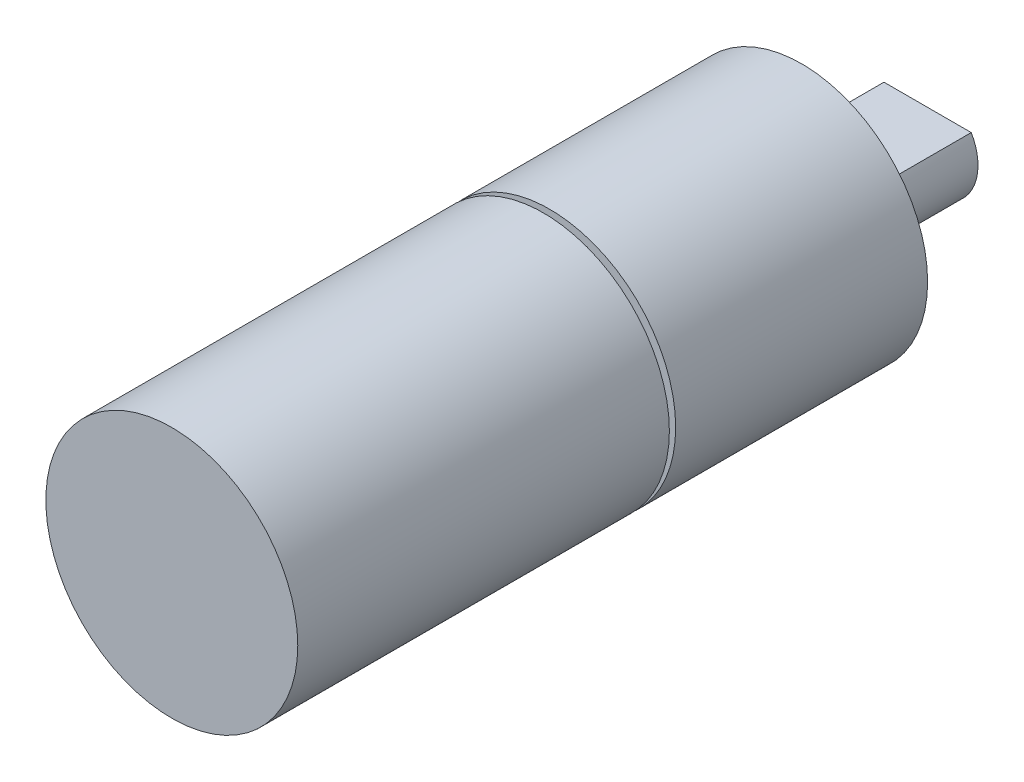
ISO-10303-21;
HEADER;
FILE_DESCRIPTION(('STEP AP214'),'2;1');
FILE_NAME('part.step','',(''),(''),'','','');
FILE_SCHEMA(('AUTOMOTIVE_DESIGN { 1 0 10303 214 1 1 1 1 }'));
ENDSEC;
DATA;
#1=APPLICATION_CONTEXT('core data for automotive mechanical design processes');
#2=APPLICATION_PROTOCOL_DEFINITION('international standard','automotive_design',2000,#1);
#3=PRODUCT_CONTEXT('',#1,'mechanical');
#4=PRODUCT('Part','Part','',(#3));
#5=PRODUCT_RELATED_PRODUCT_CATEGORY('part','',(#4));
#6=PRODUCT_DEFINITION_FORMATION('','',#4);
#7=PRODUCT_DEFINITION_CONTEXT('part definition',#1,'design');
#8=PRODUCT_DEFINITION('design','',#6,#7);
#9=PRODUCT_DEFINITION_SHAPE('','',#8);
#10=(LENGTH_UNIT() NAMED_UNIT(*) SI_UNIT(.MILLI.,.METRE.));
#11=(NAMED_UNIT(*) PLANE_ANGLE_UNIT() SI_UNIT($,.RADIAN.));
#12=(NAMED_UNIT(*) SI_UNIT($,.STERADIAN.) SOLID_ANGLE_UNIT());
#13=UNCERTAINTY_MEASURE_WITH_UNIT(LENGTH_MEASURE(1.E-05),#10,'distance_accuracy_value','');
#14=(GEOMETRIC_REPRESENTATION_CONTEXT(3) GLOBAL_UNCERTAINTY_ASSIGNED_CONTEXT((#13)) GLOBAL_UNIT_ASSIGNED_CONTEXT((#10,
#11,#12)) REPRESENTATION_CONTEXT('',''));
#15=CARTESIAN_POINT('',(0.,0.,0.));
#16=DIRECTION('',(0.,0.,1.));
#17=DIRECTION('',(1.,0.,0.));
#18=AXIS2_PLACEMENT_3D('',#15,#16,#17);
#19=CARTESIAN_POINT('',(0.,0.,24.4652891172359));
#20=DIRECTION('',(0.,0.,1.));
#21=DIRECTION('',(1.,0.,0.));
#22=AXIS2_PLACEMENT_3D('',#19,#20,#21);
#23=CYLINDRICAL_SURFACE('',#22,20.);
#24=CARTESIAN_POINT('',(0.,0.,-60.));
#25=DIRECTION('',(0.,0.,-1.));
#26=DIRECTION('',(-1.,0.,0.));
#27=AXIS2_PLACEMENT_3D('',#24,#25,#26);
#28=CIRCLE('',#27,20.);
#29=CARTESIAN_POINT('',(-20.,0.,-60.));
#30=VERTEX_POINT('',#29);
#31=EDGE_CURVE('E121',#30,#30,#28,.T.);
#32=ORIENTED_EDGE('',*,*,#31,.T.);
#33=EDGE_LOOP('',(#32));
#34=FACE_BOUND('',#33,.T.);
#35=CARTESIAN_POINT('',(0.,0.,-100.));
#36=DIRECTION('',(0.,0.,1.));
#37=DIRECTION('',(1.,0.,0.));
#38=AXIS2_PLACEMENT_3D('',#35,#36,#37);
#39=CIRCLE('',#38,20.);
#40=CARTESIAN_POINT('',(20.,0.,-100.));
#41=VERTEX_POINT('',#40);
#42=EDGE_CURVE('E47',#41,#41,#39,.T.);
#43=ORIENTED_EDGE('',*,*,#42,.T.);
#44=EDGE_LOOP('',(#43));
#45=FACE_BOUND('',#44,.T.);
#46=ADVANCED_FACE('F39',(#34,#45),#23,.T.);
#47=CARTESIAN_POINT('',(0.,20.,-100.));
#48=DIRECTION('',(0.,0.,1.));
#49=DIRECTION('',(1.,0.,0.));
#50=AXIS2_PLACEMENT_3D('',#47,#48,#49);
#51=PLANE('',#50);
#52=ORIENTED_EDGE('',*,*,#42,.F.);
#53=EDGE_LOOP('',(#52));
#54=FACE_BOUND('',#53,.T.);
#55=CARTESIAN_POINT('',(0.,0.,-100.));
#56=DIRECTION('',(0.,0.,1.));
#57=DIRECTION('',(1.,0.,0.));
#58=AXIS2_PLACEMENT_3D('',#55,#56,#57);
#59=CIRCLE('',#58,8.);
#60=CARTESIAN_POINT('',(8.,0.,-100.));
#61=VERTEX_POINT('',#60);
#62=EDGE_CURVE('E80',#61,#61,#59,.T.);
#63=ORIENTED_EDGE('',*,*,#62,.T.);
#64=EDGE_LOOP('',(#63));
#65=FACE_BOUND('',#64,.T.);
#66=ADVANCED_FACE('F89',(#54,#65),#51,.F.);
#67=CARTESIAN_POINT('',(0.,0.,24.4652891172359));
#68=DIRECTION('',(0.,0.,1.));
#69=DIRECTION('',(1.,0.,0.));
#70=AXIS2_PLACEMENT_3D('',#67,#68,#69);
#71=CYLINDRICAL_SURFACE('',#70,8.);
#72=CARTESIAN_POINT('',(0.,0.,-120.));
#73=DIRECTION('',(0.,0.,1.));
#74=DIRECTION('',(1.,0.,0.));
#75=AXIS2_PLACEMENT_3D('',#72,#73,#74);
#76=CIRCLE('',#75,8.);
#77=CARTESIAN_POINT('',(-6.92820323027551,4.,-120.));
#78=VERTEX_POINT('',#77);
#79=CARTESIAN_POINT('',(6.92820323027551,4.,-120.));
#80=VERTEX_POINT('',#79);
#81=EDGE_CURVE('E77',#78,#80,#76,.T.);
#82=ORIENTED_EDGE('',*,*,#81,.T.);
#83=DIRECTION('',(0.,0.,-1.));
#84=VECTOR('',#83,1.);
#85=CARTESIAN_POINT('',(6.92820323027551,4.,-105.));
#86=LINE('',#85,#84);
#87=CARTESIAN_POINT('',(6.92820323027551,4.,-105.));
#88=VERTEX_POINT('',#87);
#89=EDGE_CURVE('E54',#88,#80,#86,.T.);
#90=ORIENTED_EDGE('',*,*,#89,.F.);
#91=CARTESIAN_POINT('',(0.,0.,-105.));
#92=DIRECTION('',(0.,0.,-1.));
#93=DIRECTION('',(-1.,0.,0.));
#94=AXIS2_PLACEMENT_3D('',#91,#92,#93);
#95=CIRCLE('',#94,8.);
#96=CARTESIAN_POINT('',(-6.92820323027551,4.,-105.));
#97=VERTEX_POINT('',#96);
#98=EDGE_CURVE('E70',#97,#88,#95,.T.);
#99=ORIENTED_EDGE('',*,*,#98,.F.);
#100=DIRECTION('',(0.,0.,-1.));
#101=VECTOR('',#100,1.);
#102=CARTESIAN_POINT('',(-6.92820323027551,4.,-105.));
#103=LINE('',#102,#101);
#104=EDGE_CURVE('E60',#97,#78,#103,.T.);
#105=ORIENTED_EDGE('',*,*,#104,.T.);
#106=EDGE_LOOP('',(#82,#90,#99,#105));
#107=FACE_BOUND('',#106,.T.);
#108=ORIENTED_EDGE('',*,*,#62,.F.);
#109=EDGE_LOOP('',(#108));
#110=FACE_BOUND('',#109,.T.);
#111=ADVANCED_FACE('F75',(#107,#110),#71,.T.);
#112=CARTESIAN_POINT('',(0.,8.,-120.));
#113=DIRECTION('',(0.,0.,1.));
#114=DIRECTION('',(1.,0.,0.));
#115=AXIS2_PLACEMENT_3D('',#112,#113,#114);
#116=PLANE('',#115);
#117=ORIENTED_EDGE('',*,*,#81,.F.);
#118=DIRECTION('',(-1.,0.,0.));
#119=VECTOR('',#118,1.);
#120=CARTESIAN_POINT('',(6.92820323027551,4.,-120.));
#121=LINE('',#120,#119);
#122=EDGE_CURVE('E65',#80,#78,#121,.T.);
#123=ORIENTED_EDGE('',*,*,#122,.F.);
#124=EDGE_LOOP('',(#117,#123));
#125=FACE_BOUND('',#124,.T.);
#126=ADVANCED_FACE('F79',(#125),#116,.F.);
#127=CARTESIAN_POINT('',(6.92820323027551,4.,-105.));
#128=DIRECTION('',(0.,-1.,0.));
#129=DIRECTION('',(0.,0.,-1.));
#130=AXIS2_PLACEMENT_3D('',#127,#128,#129);
#131=PLANE('',#130);
#132=ORIENTED_EDGE('',*,*,#122,.T.);
#133=ORIENTED_EDGE('',*,*,#104,.F.);
#134=DIRECTION('',(-1.,0.,0.));
#135=VECTOR('',#134,1.);
#136=CARTESIAN_POINT('',(6.92820323027551,4.,-105.));
#137=LINE('',#136,#135);
#138=EDGE_CURVE('E130',#88,#97,#137,.T.);
#139=ORIENTED_EDGE('',*,*,#138,.F.);
#140=ORIENTED_EDGE('',*,*,#89,.T.);
#141=EDGE_LOOP('',(#132,#133,#139,#140));
#142=FACE_BOUND('',#141,.T.);
#143=ADVANCED_FACE('F66',(#142),#131,.F.);
#144=CARTESIAN_POINT('',(0.,0.,-105.));
#145=DIRECTION('',(0.,0.,-1.));
#146=DIRECTION('',(-1.,0.,0.));
#147=AXIS2_PLACEMENT_3D('',#144,#145,#146);
#148=PLANE('',#147);
#149=ORIENTED_EDGE('',*,*,#98,.T.);
#150=ORIENTED_EDGE('',*,*,#138,.T.);
#151=EDGE_LOOP('',(#149,#150));
#152=FACE_BOUND('',#151,.T.);
#153=ADVANCED_FACE('F132',(#152),#148,.T.);
#154=CARTESIAN_POINT('',(0.,0.,-59.));
#155=DIRECTION('',(0.,0.,-1.));
#156=DIRECTION('',(-1.,0.,0.));
#157=AXIS2_PLACEMENT_3D('',#154,#155,#156);
#158=PLANE('',#157);
#159=CARTESIAN_POINT('',(0.,0.,-59.));
#160=DIRECTION('',(0.,0.,-1.));
#161=DIRECTION('',(-1.,0.,0.));
#162=AXIS2_PLACEMENT_3D('',#159,#160,#161);
#163=CIRCLE('',#162,18.5);
#164=CARTESIAN_POINT('',(-18.5,0.,-59.));
#165=VERTEX_POINT('',#164);
#166=EDGE_CURVE('E123',#165,#165,#163,.T.);
#167=ORIENTED_EDGE('',*,*,#166,.F.);
#168=EDGE_LOOP('',(#167));
#169=FACE_BOUND('',#168,.T.);
#170=CARTESIAN_POINT('',(0.,0.,-59.));
#171=DIRECTION('',(0.,0.,-1.));
#172=DIRECTION('',(-1.,0.,0.));
#173=AXIS2_PLACEMENT_3D('',#170,#171,#172);
#174=CIRCLE('',#173,20.);
#175=CARTESIAN_POINT('',(-20.,0.,-59.));
#176=VERTEX_POINT('',#175);
#177=EDGE_CURVE('E71',#176,#176,#174,.T.);
#178=ORIENTED_EDGE('',*,*,#177,.T.);
#179=EDGE_LOOP('',(#178));
#180=FACE_BOUND('',#179,.T.);
#181=ADVANCED_FACE('F133',(#169,#180),#158,.T.);
#182=CARTESIAN_POINT('',(0.,0.,-60.));
#183=DIRECTION('',(0.,0.,-1.));
#184=DIRECTION('',(-1.,0.,0.));
#185=AXIS2_PLACEMENT_3D('',#182,#183,#184);
#186=PLANE('',#185);
#187=CARTESIAN_POINT('',(0.,0.,-60.));
#188=DIRECTION('',(0.,0.,-1.));
#189=DIRECTION('',(-1.,0.,0.));
#190=AXIS2_PLACEMENT_3D('',#187,#188,#189);
#191=CIRCLE('',#190,18.5);
#192=CARTESIAN_POINT('',(-18.5,0.,-60.));
#193=VERTEX_POINT('',#192);
#194=EDGE_CURVE('E126',#193,#193,#191,.T.);
#195=ORIENTED_EDGE('',*,*,#194,.T.);
#196=EDGE_LOOP('',(#195));
#197=FACE_BOUND('',#196,.T.);
#198=ORIENTED_EDGE('',*,*,#31,.F.);
#199=EDGE_LOOP('',(#198));
#200=FACE_BOUND('',#199,.T.);
#201=ADVANCED_FACE('F138',(#197,#200),#186,.F.);
#202=CARTESIAN_POINT('',(0.,0.,-59.));
#203=DIRECTION('',(0.,0.,-1.));
#204=DIRECTION('',(-1.,0.,0.));
#205=AXIS2_PLACEMENT_3D('',#202,#203,#204);
#206=CYLINDRICAL_SURFACE('',#205,18.5);
#207=ORIENTED_EDGE('',*,*,#166,.T.);
#208=EDGE_LOOP('',(#207));
#209=FACE_BOUND('',#208,.T.);
#210=ORIENTED_EDGE('',*,*,#194,.F.);
#211=EDGE_LOOP('',(#210));
#212=FACE_BOUND('',#211,.T.);
#213=ADVANCED_FACE('F114',(#209,#212),#206,.T.);
#214=CARTESIAN_POINT('',(0.,0.,0.));
#215=DIRECTION('',(0.,0.,-1.));
#216=DIRECTION('',(-1.,0.,0.));
#217=AXIS2_PLACEMENT_3D('',#214,#215,#216);
#218=PLANE('',#217);
#219=CARTESIAN_POINT('',(0.,0.,0.));
#220=DIRECTION('',(0.,0.,1.));
#221=DIRECTION('',(1.,0.,0.));
#222=AXIS2_PLACEMENT_3D('',#219,#220,#221);
#223=CIRCLE('',#222,20.);
#224=CARTESIAN_POINT('',(20.,0.,0.));
#225=VERTEX_POINT('',#224);
#226=EDGE_CURVE('E11',#225,#225,#223,.T.);
#227=ORIENTED_EDGE('',*,*,#226,.T.);
#228=EDGE_LOOP('',(#227));
#229=FACE_BOUND('',#228,.T.);
#230=ADVANCED_FACE('F41',(#229),#218,.F.);
#231=ORIENTED_EDGE('',*,*,#226,.F.);
#232=EDGE_LOOP('',(#231));
#233=FACE_BOUND('',#232,.T.);
#234=ORIENTED_EDGE('',*,*,#177,.F.);
#235=EDGE_LOOP('',(#234));
#236=FACE_BOUND('',#235,.T.);
#237=ADVANCED_FACE('F102',(#233,#236),#23,.T.);
#238=CLOSED_SHELL('',(#46,#66,#111,#126,#143,#153,#181,#201,#213,#230,#237));
#239=MANIFOLD_SOLID_BREP('B2',#238);
#240=ADVANCED_BREP_SHAPE_REPRESENTATION('',(#18,#239),#14);
#241=SHAPE_DEFINITION_REPRESENTATION(#9,#240);
ENDSEC;
END-ISO-10303-21;
